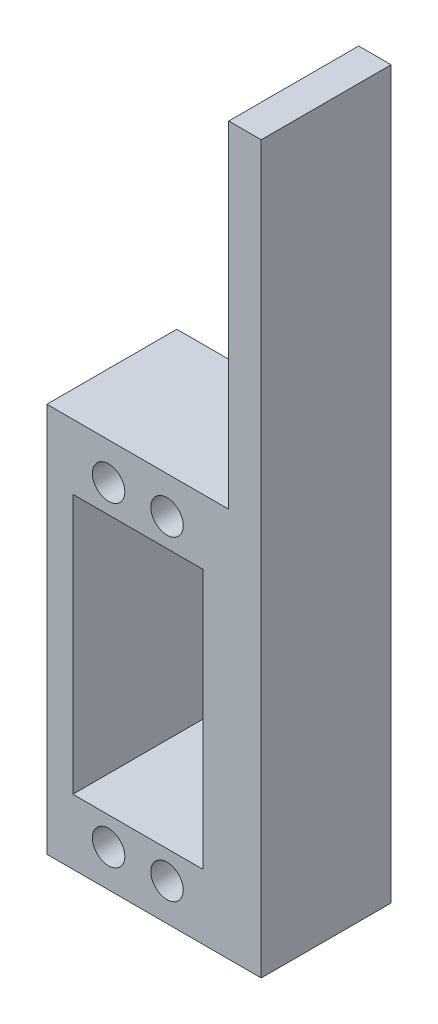
ISO-10303-21;
HEADER;
FILE_DESCRIPTION(('STEP AP214'),'2;1');
FILE_NAME('part.step','',(''),(''),'','','');
FILE_SCHEMA(('AUTOMOTIVE_DESIGN { 1 0 10303 214 1 1 1 1 }'));
ENDSEC;
DATA;
#1=APPLICATION_CONTEXT('core data for automotive mechanical design processes');
#2=APPLICATION_PROTOCOL_DEFINITION('international standard','automotive_design',2000,#1);
#3=PRODUCT_CONTEXT('',#1,'mechanical');
#4=PRODUCT('Part','Part','',(#3));
#5=PRODUCT_RELATED_PRODUCT_CATEGORY('part','',(#4));
#6=PRODUCT_DEFINITION_FORMATION('','',#4);
#7=PRODUCT_DEFINITION_CONTEXT('part definition',#1,'design');
#8=PRODUCT_DEFINITION('design','',#6,#7);
#9=PRODUCT_DEFINITION_SHAPE('','',#8);
#10=(LENGTH_UNIT() NAMED_UNIT(*) SI_UNIT(.MILLI.,.METRE.));
#11=(NAMED_UNIT(*) PLANE_ANGLE_UNIT() SI_UNIT($,.RADIAN.));
#12=(NAMED_UNIT(*) SI_UNIT($,.STERADIAN.) SOLID_ANGLE_UNIT());
#13=UNCERTAINTY_MEASURE_WITH_UNIT(LENGTH_MEASURE(1.E-05),#10,'distance_accuracy_value','');
#14=(GEOMETRIC_REPRESENTATION_CONTEXT(3) GLOBAL_UNCERTAINTY_ASSIGNED_CONTEXT((#13)) GLOBAL_UNIT_ASSIGNED_CONTEXT((#10,
#11,#12)) REPRESENTATION_CONTEXT('',''));
#15=CARTESIAN_POINT('',(0.,0.,0.));
#16=DIRECTION('',(0.,0.,1.));
#17=DIRECTION('',(1.,0.,0.));
#18=AXIS2_PLACEMENT_3D('',#15,#16,#17);
#19=CARTESIAN_POINT('',(0.,0.,20.));
#20=DIRECTION('',(0.,0.,1.));
#21=DIRECTION('',(1.,0.,0.));
#22=AXIS2_PLACEMENT_3D('',#19,#20,#21);
#23=PLANE('',#22);
#24=CARTESIAN_POINT('',(-12.1760353916496,38.6013833992095,20.));
#25=DIRECTION('',(0.,0.,1.));
#26=DIRECTION('',(1.,0.,0.));
#27=AXIS2_PLACEMENT_3D('',#24,#25,#26);
#28=CIRCLE('',#27,2.5);
#29=CARTESIAN_POINT('',(-9.67603539164957,38.6013833992095,20.));
#30=VERTEX_POINT('',#29);
#31=EDGE_CURVE('E153',#30,#30,#28,.T.);
#32=ORIENTED_EDGE('',*,*,#31,.F.);
#33=EDGE_LOOP('',(#32));
#34=FACE_BOUND('',#33,.T.);
#35=CARTESIAN_POINT('',(-12.1760353916496,-9.99861660079051,20.));
#36=DIRECTION('',(0.,0.,1.));
#37=DIRECTION('',(1.,0.,0.));
#38=AXIS2_PLACEMENT_3D('',#35,#36,#37);
#39=CIRCLE('',#38,2.5);
#40=CARTESIAN_POINT('',(-9.67603539164957,-9.99861660079051,20.));
#41=VERTEX_POINT('',#40);
#42=EDGE_CURVE('E165',#41,#41,#39,.T.);
#43=ORIENTED_EDGE('',*,*,#42,.F.);
#44=EDGE_LOOP('',(#43));
#45=FACE_BOUND('',#44,.T.);
#46=DIRECTION('',(1.,0.,0.));
#47=VECTOR('',#46,1.);
#48=CARTESIAN_POINT('',(2.32396460835043,-15.6986166007905,20.));
#49=LINE('',#48,#47);
#50=CARTESIAN_POINT('',(-21.6760353916496,-15.6986166007905,20.));
#51=VERTEX_POINT('',#50);
#52=CARTESIAN_POINT('',(11.3239646083504,-15.6986166007905,20.));
#53=VERTEX_POINT('',#52);
#54=EDGE_CURVE('E196',#51,#53,#49,.T.);
#55=ORIENTED_EDGE('',*,*,#54,.T.);
#56=DIRECTION('',(0.,-1.,0.));
#57=VECTOR('',#56,1.);
#58=CARTESIAN_POINT('',(11.3239646083504,-15.6986166007905,20.));
#59=LINE('',#58,#57);
#60=CARTESIAN_POINT('',(11.3239646083504,96.0697513343689,20.));
#61=VERTEX_POINT('',#60);
#62=EDGE_CURVE('E130',#61,#53,#59,.T.);
#63=ORIENTED_EDGE('',*,*,#62,.F.);
#64=DIRECTION('',(1.,0.,0.));
#65=VECTOR('',#64,1.);
#66=CARTESIAN_POINT('',(6.32396460835042,96.0697513343689,20.));
#67=LINE('',#66,#65);
#68=CARTESIAN_POINT('',(6.32396460835042,96.0697513343689,20.));
#69=VERTEX_POINT('',#68);
#70=EDGE_CURVE('E120',#69,#61,#67,.T.);
#71=ORIENTED_EDGE('',*,*,#70,.F.);
#72=DIRECTION('',(0.,1.,0.));
#73=VECTOR('',#72,1.);
#74=CARTESIAN_POINT('',(6.32396460835042,44.3013833992095,20.));
#75=LINE('',#74,#73);
#76=CARTESIAN_POINT('',(6.32396460835042,44.3013833992095,20.));
#77=VERTEX_POINT('',#76);
#78=EDGE_CURVE('E112',#77,#69,#75,.T.);
#79=ORIENTED_EDGE('',*,*,#78,.F.);
#80=DIRECTION('',(-1.,0.,0.));
#81=VECTOR('',#80,1.);
#82=CARTESIAN_POINT('',(-21.6760353916496,44.3013833992095,20.));
#83=LINE('',#82,#81);
#84=CARTESIAN_POINT('',(-21.6760353916496,44.3013833992095,20.));
#85=VERTEX_POINT('',#84);
#86=EDGE_CURVE('E198',#77,#85,#83,.T.);
#87=ORIENTED_EDGE('',*,*,#86,.T.);
#88=DIRECTION('',(0.,-1.,0.));
#89=VECTOR('',#88,1.);
#90=CARTESIAN_POINT('',(-21.6760353916496,34.3013833992095,20.));
#91=LINE('',#90,#89);
#92=EDGE_CURVE('E201',#85,#51,#91,.T.);
#93=ORIENTED_EDGE('',*,*,#92,.T.);
#94=EDGE_LOOP('',(#55,#63,#71,#79,#87,#93));
#95=FACE_BOUND('',#94,.T.);
#96=DIRECTION('',(1.,0.,0.));
#97=VECTOR('',#96,1.);
#98=CARTESIAN_POINT('',(2.32396460835043,-5.69861660079051,20.));
#99=LINE('',#98,#97);
#100=CARTESIAN_POINT('',(-17.6760353916496,-5.69861660079051,20.));
#101=VERTEX_POINT('',#100);
#102=CARTESIAN_POINT('',(2.32396460835043,-5.69861660079051,20.));
#103=VERTEX_POINT('',#102);
#104=EDGE_CURVE('E172',#101,#103,#99,.T.);
#105=ORIENTED_EDGE('',*,*,#104,.F.);
#106=DIRECTION('',(0.,-1.,0.));
#107=VECTOR('',#106,1.);
#108=CARTESIAN_POINT('',(-17.6760353916496,34.3013833992095,20.));
#109=LINE('',#108,#107);
#110=CARTESIAN_POINT('',(-17.6760353916496,34.3013833992095,20.));
#111=VERTEX_POINT('',#110);
#112=EDGE_CURVE('E170',#111,#101,#109,.T.);
#113=ORIENTED_EDGE('',*,*,#112,.F.);
#114=DIRECTION('',(-1.,0.,0.));
#115=VECTOR('',#114,1.);
#116=CARTESIAN_POINT('',(-17.6760353916496,34.3013833992095,20.));
#117=LINE('',#116,#115);
#118=CARTESIAN_POINT('',(2.32396460835043,34.3013833992095,20.));
#119=VERTEX_POINT('',#118);
#120=EDGE_CURVE('E177',#119,#111,#117,.T.);
#121=ORIENTED_EDGE('',*,*,#120,.F.);
#122=DIRECTION('',(0.,1.,0.));
#123=VECTOR('',#122,1.);
#124=CARTESIAN_POINT('',(2.32396460835043,34.3013833992095,20.));
#125=LINE('',#124,#123);
#126=EDGE_CURVE('E175',#103,#119,#125,.T.);
#127=ORIENTED_EDGE('',*,*,#126,.F.);
#128=EDGE_LOOP('',(#105,#113,#121,#127));
#129=FACE_BOUND('',#128,.T.);
#130=CARTESIAN_POINT('',(-3.17603539164957,-9.99861660079051,20.));
#131=DIRECTION('',(0.,0.,1.));
#132=DIRECTION('',(1.,0.,0.));
#133=AXIS2_PLACEMENT_3D('',#130,#131,#132);
#134=CIRCLE('',#133,2.5);
#135=CARTESIAN_POINT('',(-0.676035391649568,-9.99861660079051,20.));
#136=VERTEX_POINT('',#135);
#137=EDGE_CURVE('E159',#136,#136,#134,.T.);
#138=ORIENTED_EDGE('',*,*,#137,.F.);
#139=EDGE_LOOP('',(#138));
#140=FACE_BOUND('',#139,.T.);
#141=CARTESIAN_POINT('',(-3.17603539164957,38.6013833992095,20.));
#142=DIRECTION('',(0.,0.,1.));
#143=DIRECTION('',(1.,0.,0.));
#144=AXIS2_PLACEMENT_3D('',#141,#142,#143);
#145=CIRCLE('',#144,2.5);
#146=CARTESIAN_POINT('',(-0.67603539164957,38.6013833992095,20.));
#147=VERTEX_POINT('',#146);
#148=EDGE_CURVE('E147',#147,#147,#145,.T.);
#149=ORIENTED_EDGE('',*,*,#148,.F.);
#150=EDGE_LOOP('',(#149));
#151=FACE_BOUND('',#150,.T.);
#152=ADVANCED_FACE('F33',(#34,#45,#95,#129,#140,#151),#23,.T.);
#153=CARTESIAN_POINT('',(0.,0.,0.));
#154=DIRECTION('',(0.,0.,1.));
#155=DIRECTION('',(1.,0.,0.));
#156=AXIS2_PLACEMENT_3D('',#153,#154,#155);
#157=PLANE('',#156);
#158=DIRECTION('',(-1.,0.,0.));
#159=VECTOR('',#158,1.);
#160=CARTESIAN_POINT('',(-21.6760353916496,44.3013833992095,0.));
#161=LINE('',#160,#159);
#162=CARTESIAN_POINT('',(6.32396460835042,44.3013833992095,0.));
#163=VERTEX_POINT('',#162);
#164=CARTESIAN_POINT('',(-21.6760353916496,44.3013833992095,0.));
#165=VERTEX_POINT('',#164);
#166=EDGE_CURVE('E195',#163,#165,#161,.T.);
#167=ORIENTED_EDGE('',*,*,#166,.F.);
#168=DIRECTION('',(0.,1.,0.));
#169=VECTOR('',#168,1.);
#170=CARTESIAN_POINT('',(6.32396460835042,44.3013833992095,0.));
#171=LINE('',#170,#169);
#172=CARTESIAN_POINT('',(6.32396460835042,96.0697513343689,0.));
#173=VERTEX_POINT('',#172);
#174=EDGE_CURVE('E137',#163,#173,#171,.T.);
#175=ORIENTED_EDGE('',*,*,#174,.T.);
#176=DIRECTION('',(1.,0.,0.));
#177=VECTOR('',#176,1.);
#178=CARTESIAN_POINT('',(6.32396460835042,96.0697513343689,0.));
#179=LINE('',#178,#177);
#180=CARTESIAN_POINT('',(11.3239646083504,96.0697513343689,0.));
#181=VERTEX_POINT('',#180);
#182=EDGE_CURVE('E128',#173,#181,#179,.T.);
#183=ORIENTED_EDGE('',*,*,#182,.T.);
#184=DIRECTION('',(0.,-1.,0.));
#185=VECTOR('',#184,1.);
#186=CARTESIAN_POINT('',(11.3239646083504,-15.6986166007905,0.));
#187=LINE('',#186,#185);
#188=CARTESIAN_POINT('',(11.3239646083504,-15.6986166007905,0.));
#189=VERTEX_POINT('',#188);
#190=EDGE_CURVE('E121',#181,#189,#187,.T.);
#191=ORIENTED_EDGE('',*,*,#190,.T.);
#192=DIRECTION('',(1.,0.,0.));
#193=VECTOR('',#192,1.);
#194=CARTESIAN_POINT('',(2.32396460835043,-15.6986166007905,0.));
#195=LINE('',#194,#193);
#196=CARTESIAN_POINT('',(-21.6760353916496,-15.6986166007905,0.));
#197=VERTEX_POINT('',#196);
#198=EDGE_CURVE('E199',#197,#189,#195,.T.);
#199=ORIENTED_EDGE('',*,*,#198,.F.);
#200=DIRECTION('',(0.,-1.,0.));
#201=VECTOR('',#200,1.);
#202=CARTESIAN_POINT('',(-21.6760353916496,34.3013833992095,0.));
#203=LINE('',#202,#201);
#204=EDGE_CURVE('E206',#165,#197,#203,.T.);
#205=ORIENTED_EDGE('',*,*,#204,.F.);
#206=EDGE_LOOP('',(#167,#175,#183,#191,#199,#205));
#207=FACE_BOUND('',#206,.T.);
#208=DIRECTION('',(0.,-1.,0.));
#209=VECTOR('',#208,1.);
#210=CARTESIAN_POINT('',(-17.6760353916496,34.3013833992095,0.));
#211=LINE('',#210,#209);
#212=CARTESIAN_POINT('',(-17.6760353916496,34.3013833992095,0.));
#213=VERTEX_POINT('',#212);
#214=CARTESIAN_POINT('',(-17.6760353916496,-5.69861660079051,0.));
#215=VERTEX_POINT('',#214);
#216=EDGE_CURVE('E56',#213,#215,#211,.T.);
#217=ORIENTED_EDGE('',*,*,#216,.T.);
#218=DIRECTION('',(1.,0.,0.));
#219=VECTOR('',#218,1.);
#220=CARTESIAN_POINT('',(2.32396460835043,-5.69861660079051,0.));
#221=LINE('',#220,#219);
#222=CARTESIAN_POINT('',(2.32396460835043,-5.69861660079051,0.));
#223=VERTEX_POINT('',#222);
#224=EDGE_CURVE('E181',#215,#223,#221,.T.);
#225=ORIENTED_EDGE('',*,*,#224,.T.);
#226=DIRECTION('',(0.,1.,0.));
#227=VECTOR('',#226,1.);
#228=CARTESIAN_POINT('',(2.32396460835043,34.3013833992095,0.));
#229=LINE('',#228,#227);
#230=CARTESIAN_POINT('',(2.32396460835043,34.3013833992095,0.));
#231=VERTEX_POINT('',#230);
#232=EDGE_CURVE('E184',#223,#231,#229,.T.);
#233=ORIENTED_EDGE('',*,*,#232,.T.);
#234=DIRECTION('',(-1.,0.,0.));
#235=VECTOR('',#234,1.);
#236=CARTESIAN_POINT('',(-17.6760353916496,34.3013833992095,0.));
#237=LINE('',#236,#235);
#238=EDGE_CURVE('E173',#231,#213,#237,.T.);
#239=ORIENTED_EDGE('',*,*,#238,.T.);
#240=EDGE_LOOP('',(#217,#225,#233,#239));
#241=FACE_BOUND('',#240,.T.);
#242=CARTESIAN_POINT('',(-12.1760353916496,-9.99861660079051,0.));
#243=DIRECTION('',(0.,0.,1.));
#244=DIRECTION('',(1.,0.,0.));
#245=AXIS2_PLACEMENT_3D('',#242,#243,#244);
#246=CIRCLE('',#245,2.5);
#247=CARTESIAN_POINT('',(-9.67603539164957,-9.99861660079051,0.));
#248=VERTEX_POINT('',#247);
#249=EDGE_CURVE('E162',#248,#248,#246,.T.);
#250=ORIENTED_EDGE('',*,*,#249,.T.);
#251=EDGE_LOOP('',(#250));
#252=FACE_BOUND('',#251,.T.);
#253=CARTESIAN_POINT('',(-3.17603539164957,-9.99861660079051,0.));
#254=DIRECTION('',(0.,0.,1.));
#255=DIRECTION('',(1.,0.,0.));
#256=AXIS2_PLACEMENT_3D('',#253,#254,#255);
#257=CIRCLE('',#256,2.5);
#258=CARTESIAN_POINT('',(-0.676035391649568,-9.99861660079051,0.));
#259=VERTEX_POINT('',#258);
#260=EDGE_CURVE('E156',#259,#259,#257,.T.);
#261=ORIENTED_EDGE('',*,*,#260,.T.);
#262=EDGE_LOOP('',(#261));
#263=FACE_BOUND('',#262,.T.);
#264=CARTESIAN_POINT('',(-12.1760353916496,38.6013833992095,0.));
#265=DIRECTION('',(0.,0.,1.));
#266=DIRECTION('',(1.,0.,0.));
#267=AXIS2_PLACEMENT_3D('',#264,#265,#266);
#268=CIRCLE('',#267,2.5);
#269=CARTESIAN_POINT('',(-9.67603539164957,38.6013833992095,0.));
#270=VERTEX_POINT('',#269);
#271=EDGE_CURVE('E150',#270,#270,#268,.T.);
#272=ORIENTED_EDGE('',*,*,#271,.T.);
#273=EDGE_LOOP('',(#272));
#274=FACE_BOUND('',#273,.T.);
#275=CARTESIAN_POINT('',(-3.17603539164957,38.6013833992095,0.));
#276=DIRECTION('',(0.,0.,1.));
#277=DIRECTION('',(1.,0.,0.));
#278=AXIS2_PLACEMENT_3D('',#275,#276,#277);
#279=CIRCLE('',#278,2.5);
#280=CARTESIAN_POINT('',(-0.67603539164957,38.6013833992095,0.));
#281=VERTEX_POINT('',#280);
#282=EDGE_CURVE('E145',#281,#281,#279,.T.);
#283=ORIENTED_EDGE('',*,*,#282,.T.);
#284=EDGE_LOOP('',(#283));
#285=FACE_BOUND('',#284,.T.);
#286=ADVANCED_FACE('F220',(#207,#241,#252,#263,#274,#285),#157,.F.);
#287=CARTESIAN_POINT('',(-21.6760353916496,44.3013833992095,20.));
#288=DIRECTION('',(0.,-1.,0.));
#289=DIRECTION('',(1.,0.,0.));
#290=AXIS2_PLACEMENT_3D('',#287,#288,#289);
#291=PLANE('',#290);
#292=ORIENTED_EDGE('',*,*,#166,.T.);
#293=DIRECTION('',(0.,0.,-1.));
#294=VECTOR('',#293,1.);
#295=CARTESIAN_POINT('',(-21.6760353916496,44.3013833992095,20.));
#296=LINE('',#295,#294);
#297=EDGE_CURVE('E41',#85,#165,#296,.T.);
#298=ORIENTED_EDGE('',*,*,#297,.F.);
#299=ORIENTED_EDGE('',*,*,#86,.F.);
#300=DIRECTION('',(0.,0.,-1.));
#301=VECTOR('',#300,1.);
#302=CARTESIAN_POINT('',(6.32396460835042,44.3013833992095,20.));
#303=LINE('',#302,#301);
#304=EDGE_CURVE('E11',#77,#163,#303,.T.);
#305=ORIENTED_EDGE('',*,*,#304,.T.);
#306=EDGE_LOOP('',(#292,#298,#299,#305));
#307=FACE_BOUND('',#306,.T.);
#308=ADVANCED_FACE('F35',(#307),#291,.F.);
#309=CARTESIAN_POINT('',(-21.6760353916496,34.3013833992095,20.));
#310=DIRECTION('',(1.,0.,0.));
#311=DIRECTION('',(0.,0.,-1.));
#312=AXIS2_PLACEMENT_3D('',#309,#310,#311);
#313=PLANE('',#312);
#314=ORIENTED_EDGE('',*,*,#204,.T.);
#315=DIRECTION('',(0.,0.,-1.));
#316=VECTOR('',#315,1.);
#317=CARTESIAN_POINT('',(-21.6760353916496,-15.6986166007905,20.));
#318=LINE('',#317,#316);
#319=EDGE_CURVE('E203',#51,#197,#318,.T.);
#320=ORIENTED_EDGE('',*,*,#319,.F.);
#321=ORIENTED_EDGE('',*,*,#92,.F.);
#322=ORIENTED_EDGE('',*,*,#297,.T.);
#323=EDGE_LOOP('',(#314,#320,#321,#322));
#324=FACE_BOUND('',#323,.T.);
#325=ADVANCED_FACE('F215',(#324),#313,.F.);
#326=CARTESIAN_POINT('',(2.32396460835043,-15.6986166007905,20.));
#327=DIRECTION('',(0.,1.,0.));
#328=DIRECTION('',(0.,0.,1.));
#329=AXIS2_PLACEMENT_3D('',#326,#327,#328);
#330=PLANE('',#329);
#331=ORIENTED_EDGE('',*,*,#198,.T.);
#332=DIRECTION('',(0.,0.,-1.));
#333=VECTOR('',#332,1.);
#334=CARTESIAN_POINT('',(11.3239646083504,-15.6986166007905,20.));
#335=LINE('',#334,#333);
#336=EDGE_CURVE('E142',#53,#189,#335,.T.);
#337=ORIENTED_EDGE('',*,*,#336,.F.);
#338=ORIENTED_EDGE('',*,*,#54,.F.);
#339=ORIENTED_EDGE('',*,*,#319,.T.);
#340=EDGE_LOOP('',(#331,#337,#338,#339));
#341=FACE_BOUND('',#340,.T.);
#342=ADVANCED_FACE('F225',(#341),#330,.F.);
#343=CARTESIAN_POINT('',(-17.6760353916496,34.3013833992095,20.));
#344=DIRECTION('',(1.,0.,0.));
#345=DIRECTION('',(0.,0.,-1.));
#346=AXIS2_PLACEMENT_3D('',#343,#344,#345);
#347=PLANE('',#346);
#348=ORIENTED_EDGE('',*,*,#216,.F.);
#349=DIRECTION('',(0.,0.,-1.));
#350=VECTOR('',#349,1.);
#351=CARTESIAN_POINT('',(-17.6760353916496,34.3013833992095,20.));
#352=LINE('',#351,#350);
#353=EDGE_CURVE('E179',#111,#213,#352,.T.);
#354=ORIENTED_EDGE('',*,*,#353,.F.);
#355=ORIENTED_EDGE('',*,*,#112,.T.);
#356=DIRECTION('',(0.,0.,-1.));
#357=VECTOR('',#356,1.);
#358=CARTESIAN_POINT('',(-17.6760353916496,-5.69861660079051,20.));
#359=LINE('',#358,#357);
#360=EDGE_CURVE('E193',#101,#215,#359,.T.);
#361=ORIENTED_EDGE('',*,*,#360,.T.);
#362=EDGE_LOOP('',(#348,#354,#355,#361));
#363=FACE_BOUND('',#362,.T.);
#364=ADVANCED_FACE('F249',(#363),#347,.T.);
#365=CARTESIAN_POINT('',(2.32396460835043,-5.69861660079051,20.));
#366=DIRECTION('',(0.,1.,0.));
#367=DIRECTION('',(-1.,0.,0.));
#368=AXIS2_PLACEMENT_3D('',#365,#366,#367);
#369=PLANE('',#368);
#370=ORIENTED_EDGE('',*,*,#224,.F.);
#371=ORIENTED_EDGE('',*,*,#360,.F.);
#372=ORIENTED_EDGE('',*,*,#104,.T.);
#373=DIRECTION('',(0.,0.,-1.));
#374=VECTOR('',#373,1.);
#375=CARTESIAN_POINT('',(2.32396460835043,-5.69861660079051,20.));
#376=LINE('',#375,#374);
#377=EDGE_CURVE('E191',#103,#223,#376,.T.);
#378=ORIENTED_EDGE('',*,*,#377,.T.);
#379=EDGE_LOOP('',(#370,#371,#372,#378));
#380=FACE_BOUND('',#379,.T.);
#381=ADVANCED_FACE('F357',(#380),#369,.T.);
#382=CARTESIAN_POINT('',(2.32396460835043,34.3013833992095,20.));
#383=DIRECTION('',(-1.,0.,0.));
#384=DIRECTION('',(0.,-1.,0.));
#385=AXIS2_PLACEMENT_3D('',#382,#383,#384);
#386=PLANE('',#385);
#387=ORIENTED_EDGE('',*,*,#232,.F.);
#388=ORIENTED_EDGE('',*,*,#377,.F.);
#389=ORIENTED_EDGE('',*,*,#126,.T.);
#390=DIRECTION('',(0.,0.,-1.));
#391=VECTOR('',#390,1.);
#392=CARTESIAN_POINT('',(2.32396460835043,34.3013833992095,20.));
#393=LINE('',#392,#391);
#394=EDGE_CURVE('E48',#119,#231,#393,.T.);
#395=ORIENTED_EDGE('',*,*,#394,.T.);
#396=EDGE_LOOP('',(#387,#388,#389,#395));
#397=FACE_BOUND('',#396,.T.);
#398=ADVANCED_FACE('F349',(#397),#386,.T.);
#399=CARTESIAN_POINT('',(-17.6760353916496,34.3013833992095,20.));
#400=DIRECTION('',(0.,-1.,0.));
#401=DIRECTION('',(0.,0.,-1.));
#402=AXIS2_PLACEMENT_3D('',#399,#400,#401);
#403=PLANE('',#402);
#404=ORIENTED_EDGE('',*,*,#238,.F.);
#405=ORIENTED_EDGE('',*,*,#394,.F.);
#406=ORIENTED_EDGE('',*,*,#120,.T.);
#407=ORIENTED_EDGE('',*,*,#353,.T.);
#408=EDGE_LOOP('',(#404,#405,#406,#407));
#409=FACE_BOUND('',#408,.T.);
#410=ADVANCED_FACE('F340',(#409),#403,.T.);
#411=CARTESIAN_POINT('',(-12.1760353916496,-9.99861660079051,20.));
#412=DIRECTION('',(0.,0.,-1.));
#413=DIRECTION('',(-1.,0.,0.));
#414=AXIS2_PLACEMENT_3D('',#411,#412,#413);
#415=CYLINDRICAL_SURFACE('',#414,2.5);
#416=ORIENTED_EDGE('',*,*,#42,.T.);
#417=EDGE_LOOP('',(#416));
#418=FACE_BOUND('',#417,.T.);
#419=ORIENTED_EDGE('',*,*,#249,.F.);
#420=EDGE_LOOP('',(#419));
#421=FACE_BOUND('',#420,.T.);
#422=ADVANCED_FACE('F331',(#418,#421),#415,.F.);
#423=CARTESIAN_POINT('',(-3.17603539164957,-9.99861660079051,20.));
#424=DIRECTION('',(0.,0.,-1.));
#425=DIRECTION('',(-1.,0.,0.));
#426=AXIS2_PLACEMENT_3D('',#423,#424,#425);
#427=CYLINDRICAL_SURFACE('',#426,2.5);
#428=ORIENTED_EDGE('',*,*,#137,.T.);
#429=EDGE_LOOP('',(#428));
#430=FACE_BOUND('',#429,.T.);
#431=ORIENTED_EDGE('',*,*,#260,.F.);
#432=EDGE_LOOP('',(#431));
#433=FACE_BOUND('',#432,.T.);
#434=ADVANCED_FACE('F322',(#430,#433),#427,.F.);
#435=CARTESIAN_POINT('',(-12.1760353916496,38.6013833992095,20.));
#436=DIRECTION('',(0.,0.,-1.));
#437=DIRECTION('',(-1.,0.,0.));
#438=AXIS2_PLACEMENT_3D('',#435,#436,#437);
#439=CYLINDRICAL_SURFACE('',#438,2.5);
#440=ORIENTED_EDGE('',*,*,#31,.T.);
#441=EDGE_LOOP('',(#440));
#442=FACE_BOUND('',#441,.T.);
#443=ORIENTED_EDGE('',*,*,#271,.F.);
#444=EDGE_LOOP('',(#443));
#445=FACE_BOUND('',#444,.T.);
#446=ADVANCED_FACE('F313',(#442,#445),#439,.F.);
#447=CARTESIAN_POINT('',(-3.17603539164957,38.6013833992095,20.));
#448=DIRECTION('',(0.,0.,-1.));
#449=DIRECTION('',(-1.,0.,0.));
#450=AXIS2_PLACEMENT_3D('',#447,#448,#449);
#451=CYLINDRICAL_SURFACE('',#450,2.5);
#452=ORIENTED_EDGE('',*,*,#148,.T.);
#453=EDGE_LOOP('',(#452));
#454=FACE_BOUND('',#453,.T.);
#455=ORIENTED_EDGE('',*,*,#282,.F.);
#456=EDGE_LOOP('',(#455));
#457=FACE_BOUND('',#456,.T.);
#458=ADVANCED_FACE('F236',(#454,#457),#451,.F.);
#459=CARTESIAN_POINT('',(6.32396460835042,44.3013833992095,20.));
#460=DIRECTION('',(-1.,0.,0.));
#461=DIRECTION('',(0.,0.,1.));
#462=AXIS2_PLACEMENT_3D('',#459,#460,#461);
#463=PLANE('',#462);
#464=ORIENTED_EDGE('',*,*,#304,.F.);
#465=ORIENTED_EDGE('',*,*,#78,.T.);
#466=DIRECTION('',(0.,0.,-1.));
#467=VECTOR('',#466,1.);
#468=CARTESIAN_POINT('',(6.32396460835042,96.0697513343689,20.));
#469=LINE('',#468,#467);
#470=EDGE_CURVE('E115',#69,#173,#469,.T.);
#471=ORIENTED_EDGE('',*,*,#470,.T.);
#472=ORIENTED_EDGE('',*,*,#174,.F.);
#473=EDGE_LOOP('',(#464,#465,#471,#472));
#474=FACE_BOUND('',#473,.T.);
#475=ADVANCED_FACE('F114',(#474),#463,.T.);
#476=CARTESIAN_POINT('',(11.3239646083504,-15.6986166007905,20.));
#477=DIRECTION('',(1.,0.,0.));
#478=DIRECTION('',(0.,0.,-1.));
#479=AXIS2_PLACEMENT_3D('',#476,#477,#478);
#480=PLANE('',#479);
#481=ORIENTED_EDGE('',*,*,#190,.F.);
#482=DIRECTION('',(0.,0.,-1.));
#483=VECTOR('',#482,1.);
#484=CARTESIAN_POINT('',(11.3239646083504,96.0697513343689,20.));
#485=LINE('',#484,#483);
#486=EDGE_CURVE('E129',#61,#181,#485,.T.);
#487=ORIENTED_EDGE('',*,*,#486,.F.);
#488=ORIENTED_EDGE('',*,*,#62,.T.);
#489=ORIENTED_EDGE('',*,*,#336,.T.);
#490=EDGE_LOOP('',(#481,#487,#488,#489));
#491=FACE_BOUND('',#490,.T.);
#492=ADVANCED_FACE('F228',(#491),#480,.T.);
#493=CARTESIAN_POINT('',(6.32396460835042,96.0697513343689,20.));
#494=DIRECTION('',(0.,1.,0.));
#495=DIRECTION('',(-1.,0.,0.));
#496=AXIS2_PLACEMENT_3D('',#493,#494,#495);
#497=PLANE('',#496);
#498=ORIENTED_EDGE('',*,*,#182,.F.);
#499=ORIENTED_EDGE('',*,*,#470,.F.);
#500=ORIENTED_EDGE('',*,*,#70,.T.);
#501=ORIENTED_EDGE('',*,*,#486,.T.);
#502=EDGE_LOOP('',(#498,#499,#500,#501));
#503=FACE_BOUND('',#502,.T.);
#504=ADVANCED_FACE('F125',(#503),#497,.T.);
#505=CLOSED_SHELL('',(#152,#286,#308,#325,#342,#364,#381,#398,#410,#422,#434,#446,#458,#475,
#492,#504));
#506=MANIFOLD_SOLID_BREP('B2',#505);
#507=ADVANCED_BREP_SHAPE_REPRESENTATION('',(#18,#506),#14);
#508=SHAPE_DEFINITION_REPRESENTATION(#9,#507);
ENDSEC;
END-ISO-10303-21;
